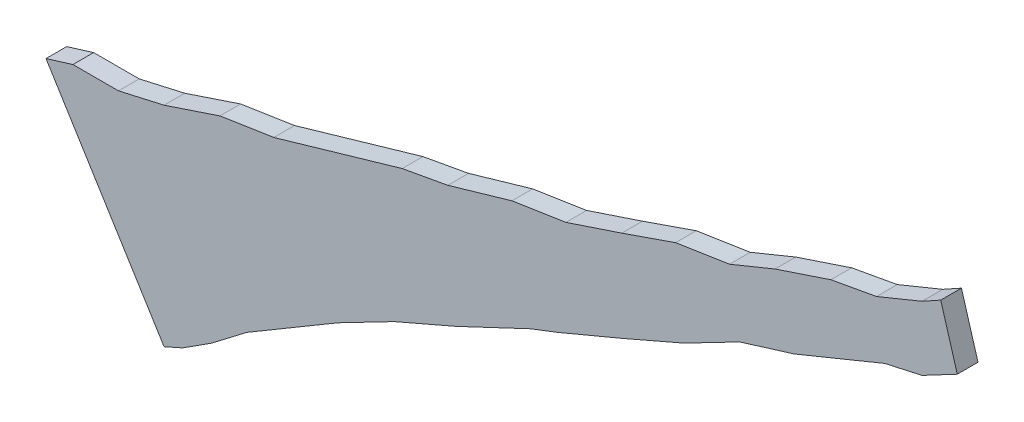
ISO-10303-21;
HEADER;
FILE_DESCRIPTION(('STEP AP214'),'2;1');
FILE_NAME('part.step','',(''),(''),'','','');
FILE_SCHEMA(('AUTOMOTIVE_DESIGN { 1 0 10303 214 1 1 1 1 }'));
ENDSEC;
DATA;
#1=APPLICATION_CONTEXT('core data for automotive mechanical design processes');
#2=APPLICATION_PROTOCOL_DEFINITION('international standard','automotive_design',2000,#1);
#3=PRODUCT_CONTEXT('',#1,'mechanical');
#4=PRODUCT('Part','Part','',(#3));
#5=PRODUCT_RELATED_PRODUCT_CATEGORY('part','',(#4));
#6=PRODUCT_DEFINITION_FORMATION('','',#4);
#7=PRODUCT_DEFINITION_CONTEXT('part definition',#1,'design');
#8=PRODUCT_DEFINITION('design','',#6,#7);
#9=PRODUCT_DEFINITION_SHAPE('','',#8);
#10=(LENGTH_UNIT() NAMED_UNIT(*) SI_UNIT(.MILLI.,.METRE.));
#11=(NAMED_UNIT(*) PLANE_ANGLE_UNIT() SI_UNIT($,.RADIAN.));
#12=(NAMED_UNIT(*) SI_UNIT($,.STERADIAN.) SOLID_ANGLE_UNIT());
#13=UNCERTAINTY_MEASURE_WITH_UNIT(LENGTH_MEASURE(1.E-05),#10,'distance_accuracy_value','');
#14=(GEOMETRIC_REPRESENTATION_CONTEXT(3) GLOBAL_UNCERTAINTY_ASSIGNED_CONTEXT((#13)) GLOBAL_UNIT_ASSIGNED_CONTEXT((#10,
#11,#12)) REPRESENTATION_CONTEXT('',''));
#15=CARTESIAN_POINT('',(0.,0.,0.));
#16=DIRECTION('',(0.,0.,1.));
#17=DIRECTION('',(1.,0.,0.));
#18=AXIS2_PLACEMENT_3D('',#15,#16,#17);
#19=CARTESIAN_POINT('',(0.,0.,0.01));
#20=DIRECTION('',(0.,0.,1.));
#21=DIRECTION('',(1.,0.,0.));
#22=AXIS2_PLACEMENT_3D('',#19,#20,#21);
#23=PLANE('',#22);
#24=DIRECTION('',(0.860926528214329,0.508729312126617,0.));
#25=VECTOR('',#24,1.);
#26=CARTESIAN_POINT('',(0.831,-0.35,0.01));
#27=LINE('',#26,#25);
#28=CARTESIAN_POINT('',(0.875,-0.324,0.01));
#29=VERTEX_POINT('',#28);
#30=CARTESIAN_POINT('',(0.831,-0.35,0.01));
#31=VERTEX_POINT('',#30);
#32=EDGE_CURVE('E250',#29,#31,#27,.F.);
#33=ORIENTED_EDGE('',*,*,#32,.F.);
#34=DIRECTION('',(0.887754531448923,0.460317164455012,0.));
#35=VECTOR('',#34,1.);
#36=CARTESIAN_POINT('',(0.875,-0.324,0.01));
#37=LINE('',#36,#35);
#38=CARTESIAN_POINT('',(0.902,-0.31,0.01));
#39=VERTEX_POINT('',#38);
#40=EDGE_CURVE('E20',#39,#29,#37,.F.);
#41=ORIENTED_EDGE('',*,*,#40,.F.);
#42=DIRECTION('',(0.917555625309921,0.397607437634309,0.));
#43=VECTOR('',#42,1.);
#44=CARTESIAN_POINT('',(0.902,-0.31,0.01));
#45=LINE('',#44,#43);
#46=CARTESIAN_POINT('',(0.932,-0.297,0.01));
#47=VERTEX_POINT('',#46);
#48=EDGE_CURVE('E239',#47,#39,#45,.F.);
#49=ORIENTED_EDGE('',*,*,#48,.F.);
#50=DIRECTION('',(0.904248646746004,0.427006305407802,0.));
#51=VECTOR('',#50,1.);
#52=CARTESIAN_POINT('',(0.932,-0.297,0.01));
#53=LINE('',#52,#51);
#54=CARTESIAN_POINT('',(0.968,-0.28,0.01));
#55=VERTEX_POINT('',#54);
#56=EDGE_CURVE('E234',#55,#47,#53,.F.);
#57=ORIENTED_EDGE('',*,*,#56,.F.);
#58=DIRECTION('',(0.933345606203054,0.358979079308882,0.));
#59=VECTOR('',#58,1.);
#60=CARTESIAN_POINT('',(0.968,-0.28,0.01));
#61=LINE('',#60,#59);
#62=CARTESIAN_POINT('',(0.980999999999999,-0.275,0.01));
#63=VERTEX_POINT('',#62);
#64=EDGE_CURVE('E261',#63,#55,#61,.F.);
#65=ORIENTED_EDGE('',*,*,#64,.F.);
#66=DIRECTION('',(0.922194381828517,0.386726676250707,0.));
#67=VECTOR('',#66,1.);
#68=CARTESIAN_POINT('',(0.981,-0.275,0.01));
#69=LINE('',#68,#67);
#70=CARTESIAN_POINT('',(1.01200000000004,-0.261999999999983,0.01));
#71=VERTEX_POINT('',#70);
#72=EDGE_CURVE('E265',#71,#63,#69,.F.);
#73=ORIENTED_EDGE('',*,*,#72,.F.);
#74=DIRECTION('',(0.917555625309921,0.397607437634309,0.));
#75=VECTOR('',#74,1.);
#76=CARTESIAN_POINT('',(1.012,-0.262,0.01));
#77=LINE('',#76,#75);
#78=CARTESIAN_POINT('',(1.042,-0.249,0.01));
#79=VERTEX_POINT('',#78);
#80=EDGE_CURVE('E269',#79,#71,#77,.F.);
#81=ORIENTED_EDGE('',*,*,#80,.F.);
#82=DIRECTION('',(0.887754531448923,0.460317164455012,0.));
#83=VECTOR('',#82,1.);
#84=CARTESIAN_POINT('',(1.042,-0.249,0.01));
#85=LINE('',#84,#83);
#86=CARTESIAN_POINT('',(1.069,-0.235,0.01));
#87=VERTEX_POINT('',#86);
#88=EDGE_CURVE('E273',#87,#79,#85,.F.);
#89=ORIENTED_EDGE('',*,*,#88,.F.);
#90=DIRECTION('',(0.955779008721961,0.294085848837488,0.));
#91=VECTOR('',#90,1.);
#92=CARTESIAN_POINT('',(1.069,-0.235,0.01));
#93=LINE('',#92,#91);
#94=CARTESIAN_POINT('',(1.095,-0.227,0.01));
#95=VERTEX_POINT('',#94);
#96=EDGE_CURVE('E277',#95,#87,#93,.F.);
#97=ORIENTED_EDGE('',*,*,#96,.F.);
#98=DIRECTION('',(0.925546956205682,0.378632845720492,0.));
#99=VECTOR('',#98,1.);
#100=CARTESIAN_POINT('',(1.095,-0.227,0.01));
#101=LINE('',#100,#99);
#102=CARTESIAN_POINT('',(1.139,-0.209,0.01));
#103=VERTEX_POINT('',#102);
#104=EDGE_CURVE('E281',#103,#95,#101,.F.);
#105=ORIENTED_EDGE('',*,*,#104,.F.);
#106=DIRECTION('',(0.976187060183946,0.216930457818688,0.));
#107=VECTOR('',#106,1.);
#108=CARTESIAN_POINT('',(1.139,-0.209,0.01));
#109=LINE('',#108,#107);
#110=CARTESIAN_POINT('',(1.157,-0.205,0.01));
#111=VERTEX_POINT('',#110);
#112=EDGE_CURVE('E285',#111,#103,#109,.F.);
#113=ORIENTED_EDGE('',*,*,#112,.F.);
#114=DIRECTION('',(0.883787916347084,0.467887720418991,0.));
#115=VECTOR('',#114,1.);
#116=CARTESIAN_POINT('',(1.157,-0.205,0.01));
#117=LINE('',#116,#115);
#118=CARTESIAN_POINT('',(1.174,-0.196,0.01));
#119=VERTEX_POINT('',#118);
#120=EDGE_CURVE('E289',#119,#111,#117,.F.);
#121=ORIENTED_EDGE('',*,*,#120,.F.);
#122=DIRECTION('',(-0.284088329691394,0.958798112708381,0.));
#123=VECTOR('',#122,1.);
#124=CARTESIAN_POINT('',(1.174,-0.196,0.01));
#125=LINE('',#124,#123);
#126=CARTESIAN_POINT('',(1.166,-0.169,0.01));
#127=VERTEX_POINT('',#126);
#128=EDGE_CURVE('E293',#127,#119,#125,.F.);
#129=ORIENTED_EDGE('',*,*,#128,.F.);
#130=DIRECTION('',(-0.874157276121542,-0.485642931178624,0.));
#131=VECTOR('',#130,1.);
#132=CARTESIAN_POINT('',(1.166,-0.169,0.01));
#133=LINE('',#132,#131);
#134=CARTESIAN_POINT('',(1.157,-0.174,0.01));
#135=VERTEX_POINT('',#134);
#136=EDGE_CURVE('E297',#135,#127,#133,.F.);
#137=ORIENTED_EDGE('',*,*,#136,.F.);
#138=DIRECTION('',(-0.925546956205682,-0.378632845720492,0.));
#139=VECTOR('',#138,1.);
#140=CARTESIAN_POINT('',(1.157,-0.174,0.01));
#141=LINE('',#140,#139);
#142=CARTESIAN_POINT('',(1.135,-0.183,0.01));
#143=VERTEX_POINT('',#142);
#144=EDGE_CURVE('E301',#143,#135,#141,.F.);
#145=ORIENTED_EDGE('',*,*,#144,.F.);
#146=DIRECTION('',(-0.983869910099904,-0.178885438200001,0.));
#147=VECTOR('',#146,1.);
#148=CARTESIAN_POINT('',(1.135,-0.183,0.01));
#149=LINE('',#148,#147);
#150=CARTESIAN_POINT('',(1.113,-0.187,0.01));
#151=VERTEX_POINT('',#150);
#152=EDGE_CURVE('E305',#151,#143,#149,.F.);
#153=ORIENTED_EDGE('',*,*,#152,.F.);
#154=DIRECTION('',(-0.948683298050524,-0.316227766016808,0.));
#155=VECTOR('',#154,1.);
#156=CARTESIAN_POINT('',(1.113,-0.187,0.01));
#157=LINE('',#156,#155);
#158=CARTESIAN_POINT('',(1.086,-0.195999999999999,0.01));
#159=VERTEX_POINT('',#158);
#160=EDGE_CURVE('E309',#159,#151,#157,.F.);
#161=ORIENTED_EDGE('',*,*,#160,.F.);
#162=DIRECTION('',(-0.925546956205682,-0.378632845720492,0.));
#163=VECTOR('',#162,1.);
#164=CARTESIAN_POINT('',(1.086,-0.196,0.01));
#165=LINE('',#164,#163);
#166=CARTESIAN_POINT('',(1.064,-0.205,0.01));
#167=VERTEX_POINT('',#166);
#168=EDGE_CURVE('E313',#167,#159,#165,.F.);
#169=ORIENTED_EDGE('',*,*,#168,.F.);
#170=DIRECTION('',(-0.988371697650623,-0.152057184253904,0.));
#171=VECTOR('',#170,1.);
#172=CARTESIAN_POINT('',(1.064,-0.205,0.01));
#173=LINE('',#172,#171);
#174=CARTESIAN_POINT('',(1.038,-0.209,0.01));
#175=VERTEX_POINT('',#174);
#176=EDGE_CURVE('E317',#175,#167,#173,.F.);
#177=ORIENTED_EDGE('',*,*,#176,.F.);
#178=DIRECTION('',(-0.944986073440252,-0.327110563883183,0.));
#179=VECTOR('',#178,1.);
#180=CARTESIAN_POINT('',(1.038,-0.209,0.01));
#181=LINE('',#180,#179);
#182=CARTESIAN_POINT('',(1.01199999999998,-0.218000000000008,0.01));
#183=VERTEX_POINT('',#182);
#184=EDGE_CURVE('E321',#183,#175,#181,.F.);
#185=ORIENTED_EDGE('',*,*,#184,.F.);
#186=DIRECTION('',(-0.948683298050524,-0.316227766016808,0.));
#187=VECTOR('',#186,1.);
#188=CARTESIAN_POINT('',(1.012,-0.218,0.01));
#189=LINE('',#188,#187);
#190=CARTESIAN_POINT('',(0.985,-0.227,0.01));
#191=VERTEX_POINT('',#190);
#192=EDGE_CURVE('E325',#191,#183,#189,.F.);
#193=ORIENTED_EDGE('',*,*,#192,.F.);
#194=DIRECTION('',(-0.988371697650623,-0.152057184253904,0.));
#195=VECTOR('',#194,1.);
#196=CARTESIAN_POINT('',(0.985,-0.227,0.01));
#197=LINE('',#196,#195);
#198=CARTESIAN_POINT('',(0.959,-0.231,0.01));
#199=VERTEX_POINT('',#198);
#200=EDGE_CURVE('E329',#199,#191,#197,.F.);
#201=ORIENTED_EDGE('',*,*,#200,.F.);
#202=DIRECTION('',(-0.96034622675361,-0.278810194864003,0.));
#203=VECTOR('',#202,1.);
#204=CARTESIAN_POINT('',(0.959,-0.231,0.01));
#205=LINE('',#204,#203);
#206=CARTESIAN_POINT('',(0.928,-0.24,0.01));
#207=VERTEX_POINT('',#206);
#208=EDGE_CURVE('E333',#207,#199,#205,.F.);
#209=ORIENTED_EDGE('',*,*,#208,.F.);
#210=DIRECTION('',(-0.983869910099904,-0.178885438200001,0.));
#211=VECTOR('',#210,1.);
#212=CARTESIAN_POINT('',(0.928,-0.24,0.01));
#213=LINE('',#212,#211);
#214=CARTESIAN_POINT('',(0.906,-0.244,0.01));
#215=VERTEX_POINT('',#214);
#216=EDGE_CURVE('E337',#215,#207,#213,.F.);
#217=ORIENTED_EDGE('',*,*,#216,.F.);
#218=DIRECTION('',(-0.96034622675361,-0.278810194864003,0.));
#219=VECTOR('',#218,1.);
#220=CARTESIAN_POINT('',(0.906,-0.244,0.01));
#221=LINE('',#220,#219);
#222=CARTESIAN_POINT('',(0.844,-0.262000000000001,0.01));
#223=VERTEX_POINT('',#222);
#224=EDGE_CURVE('E341',#223,#215,#221,.F.);
#225=ORIENTED_EDGE('',*,*,#224,.F.);
#226=DIRECTION('',(-0.988371697650623,-0.152057184253904,0.));
#227=VECTOR('',#226,1.);
#228=CARTESIAN_POINT('',(0.844,-0.262,0.01));
#229=LINE('',#228,#227);
#230=CARTESIAN_POINT('',(0.818,-0.266,0.01));
#231=VERTEX_POINT('',#230);
#232=EDGE_CURVE('E345',#231,#223,#229,.F.);
#233=ORIENTED_EDGE('',*,*,#232,.F.);
#234=DIRECTION('',(-0.948683298050524,-0.316227766016808,0.));
#235=VECTOR('',#234,1.);
#236=CARTESIAN_POINT('',(0.818,-0.266,0.01));
#237=LINE('',#236,#235);
#238=CARTESIAN_POINT('',(0.791,-0.275,0.01));
#239=VERTEX_POINT('',#238);
#240=EDGE_CURVE('E349',#239,#231,#237,.F.);
#241=ORIENTED_EDGE('',*,*,#240,.F.);
#242=DIRECTION('',(-0.975132855791455,-0.22162110358899,0.));
#243=VECTOR('',#242,1.);
#244=CARTESIAN_POINT('',(0.791,-0.275,0.01));
#245=LINE('',#244,#243);
#246=CARTESIAN_POINT('',(0.769,-0.28,0.01));
#247=VERTEX_POINT('',#246);
#248=EDGE_CURVE('E353',#247,#239,#245,.F.);
#249=ORIENTED_EDGE('',*,*,#248,.F.);
#250=DIRECTION('',(1.,0.,0.));
#251=VECTOR('',#250,1.);
#252=CARTESIAN_POINT('',(0.769,-0.28,0.01));
#253=LINE('',#252,#251);
#254=CARTESIAN_POINT('',(0.746999999999999,-0.28,0.01));
#255=VERTEX_POINT('',#254);
#256=EDGE_CURVE('E357',#255,#247,#253,.T.);
#257=ORIENTED_EDGE('',*,*,#256,.F.);
#258=DIRECTION('',(-0.955779008721961,-0.294085848837488,0.));
#259=VECTOR('',#258,1.);
#260=CARTESIAN_POINT('',(0.747,-0.28,0.01));
#261=LINE('',#260,#259);
#262=CARTESIAN_POINT('',(0.734,-0.284,0.01));
#263=VERTEX_POINT('',#262);
#264=EDGE_CURVE('E361',#263,#255,#261,.F.);
#265=ORIENTED_EDGE('',*,*,#264,.F.);
#266=DIRECTION('',(0.526672671716798,-0.850068171893696,0.));
#267=VECTOR('',#266,1.);
#268=CARTESIAN_POINT('',(0.734,-0.284,0.01));
#269=LINE('',#268,#267);
#270=CARTESIAN_POINT('',(0.791000000000001,-0.375999999999999,0.01));
#271=VERTEX_POINT('',#270);
#272=EDGE_CURVE('E365',#271,#263,#269,.F.);
#273=ORIENTED_EDGE('',*,*,#272,.F.);
#274=DIRECTION('',(0.913811548620282,0.406138466053392,0.));
#275=VECTOR('',#274,1.);
#276=CARTESIAN_POINT('',(0.791,-0.376,0.01));
#277=LINE('',#276,#275);
#278=CARTESIAN_POINT('',(0.8,-0.372,0.01));
#279=VERTEX_POINT('',#278);
#280=EDGE_CURVE('E369',#279,#271,#277,.F.);
#281=ORIENTED_EDGE('',*,*,#280,.F.);
#282=DIRECTION('',(0.841178475376567,0.540757591313479,0.));
#283=VECTOR('',#282,1.);
#284=CARTESIAN_POINT('',(0.8,-0.372,0.01));
#285=LINE('',#284,#283);
#286=CARTESIAN_POINT('',(0.814,-0.363,0.01));
#287=VERTEX_POINT('',#286);
#288=EDGE_CURVE('E373',#287,#279,#285,.F.);
#289=ORIENTED_EDGE('',*,*,#288,.F.);
#290=DIRECTION('',(0.794357832977196,0.607450107570797,0.));
#291=VECTOR('',#290,1.);
#292=CARTESIAN_POINT('',(0.814,-0.363,0.01));
#293=LINE('',#292,#291);
#294=EDGE_CURVE('E377',#31,#287,#293,.F.);
#295=ORIENTED_EDGE('',*,*,#294,.F.);
#296=EDGE_LOOP('',(#33,#41,#49,#57,#65,#73,#81,#89,#97,#105,#113,#121,#129,#137,#145,#153,#161,
#169,#177,#185,#193,#201,#209,#217,#225,#233,#241,#249,#257,#265,#273,#281,#289,#295));
#297=FACE_BOUND('',#296,.T.);
#298=ADVANCED_FACE('F17',(#297),#23,.T.);
#299=CARTESIAN_POINT('',(0.875,-0.324,0.));
#300=DIRECTION('',(0.460317164455012,-0.887754531448923,0.));
#301=DIRECTION('',(0.887754531448923,0.460317164455012,0.));
#302=AXIS2_PLACEMENT_3D('',#299,#300,#301);
#303=PLANE('',#302);
#304=DIRECTION('',(0.,0.,1.));
#305=VECTOR('',#304,1.);
#306=CARTESIAN_POINT('',(0.875000000000001,-0.324000000000001,0.));
#307=LINE('',#306,#305);
#308=CARTESIAN_POINT('',(0.875000000000001,-0.324,0.));
#309=VERTEX_POINT('',#308);
#310=EDGE_CURVE('E381',#309,#29,#307,.T.);
#311=ORIENTED_EDGE('',*,*,#310,.F.);
#312=DIRECTION('',(0.887754531448929,0.460317164455001,0.));
#313=VECTOR('',#312,1.);
#314=CARTESIAN_POINT('',(0.875,-0.324,0.));
#315=LINE('',#314,#313);
#316=CARTESIAN_POINT('',(0.902,-0.31,0.));
#317=VERTEX_POINT('',#316);
#318=EDGE_CURVE('E256',#309,#317,#315,.T.);
#319=ORIENTED_EDGE('',*,*,#318,.T.);
#320=DIRECTION('',(0.,0.,1.));
#321=VECTOR('',#320,1.);
#322=CARTESIAN_POINT('',(0.902,-0.31,0.));
#323=LINE('',#322,#321);
#324=EDGE_CURVE('E244',#39,#317,#323,.F.);
#325=ORIENTED_EDGE('',*,*,#324,.F.);
#326=ORIENTED_EDGE('',*,*,#40,.T.);
#327=EDGE_LOOP('',(#311,#319,#325,#326));
#328=FACE_BOUND('',#327,.T.);
#329=ADVANCED_FACE('F255',(#328),#303,.T.);
#330=CARTESIAN_POINT('',(0.902,-0.31,0.));
#331=DIRECTION('',(0.397607437634309,-0.917555625309921,0.));
#332=DIRECTION('',(0.917555625309921,0.397607437634309,0.));
#333=AXIS2_PLACEMENT_3D('',#330,#331,#332);
#334=PLANE('',#333);
#335=ORIENTED_EDGE('',*,*,#324,.T.);
#336=DIRECTION('',(0.917555625309925,0.397607437634299,0.));
#337=VECTOR('',#336,1.);
#338=CARTESIAN_POINT('',(0.902,-0.31,0.));
#339=LINE('',#338,#337);
#340=CARTESIAN_POINT('',(0.932,-0.297,0.));
#341=VERTEX_POINT('',#340);
#342=EDGE_CURVE('E386',#317,#341,#339,.T.);
#343=ORIENTED_EDGE('',*,*,#342,.T.);
#344=DIRECTION('',(0.,0.,1.));
#345=VECTOR('',#344,1.);
#346=CARTESIAN_POINT('',(0.932,-0.297,0.));
#347=LINE('',#346,#345);
#348=EDGE_CURVE('E246',#47,#341,#347,.F.);
#349=ORIENTED_EDGE('',*,*,#348,.F.);
#350=ORIENTED_EDGE('',*,*,#48,.T.);
#351=EDGE_LOOP('',(#335,#343,#349,#350));
#352=FACE_BOUND('',#351,.T.);
#353=ADVANCED_FACE('F241',(#352),#334,.T.);
#354=CARTESIAN_POINT('',(0.932,-0.297,0.));
#355=DIRECTION('',(0.427006305407802,-0.904248646746004,0.));
#356=DIRECTION('',(0.904248646746004,0.427006305407802,0.));
#357=AXIS2_PLACEMENT_3D('',#354,#355,#356);
#358=PLANE('',#357);
#359=ORIENTED_EDGE('',*,*,#348,.T.);
#360=DIRECTION('',(0.904248646745991,0.42700630540783,0.));
#361=VECTOR('',#360,1.);
#362=CARTESIAN_POINT('',(0.932,-0.297,0.));
#363=LINE('',#362,#361);
#364=CARTESIAN_POINT('',(0.968,-0.280000000000001,0.));
#365=VERTEX_POINT('',#364);
#366=EDGE_CURVE('E388',#341,#365,#363,.T.);
#367=ORIENTED_EDGE('',*,*,#366,.T.);
#368=DIRECTION('',(0.,0.,1.));
#369=VECTOR('',#368,1.);
#370=CARTESIAN_POINT('',(0.968,-0.28,0.));
#371=LINE('',#370,#369);
#372=EDGE_CURVE('E263',#55,#365,#371,.F.);
#373=ORIENTED_EDGE('',*,*,#372,.F.);
#374=ORIENTED_EDGE('',*,*,#56,.T.);
#375=EDGE_LOOP('',(#359,#367,#373,#374));
#376=FACE_BOUND('',#375,.T.);
#377=ADVANCED_FACE('F630',(#376),#358,.T.);
#378=CARTESIAN_POINT('',(0.968,-0.28,0.));
#379=DIRECTION('',(0.358979079308882,-0.933345606203054,0.));
#380=DIRECTION('',(0.933345606203054,0.358979079308882,0.));
#381=AXIS2_PLACEMENT_3D('',#378,#379,#380);
#382=PLANE('',#381);
#383=ORIENTED_EDGE('',*,*,#372,.T.);
#384=DIRECTION('',(0.93334560620306,0.358979079308868,0.));
#385=VECTOR('',#384,1.);
#386=CARTESIAN_POINT('',(0.968,-0.28,0.));
#387=LINE('',#386,#385);
#388=CARTESIAN_POINT('',(0.981,-0.275,0.));
#389=VERTEX_POINT('',#388);
#390=EDGE_CURVE('E391',#365,#389,#387,.T.);
#391=ORIENTED_EDGE('',*,*,#390,.T.);
#392=DIRECTION('',(0.,0.,1.));
#393=VECTOR('',#392,1.);
#394=CARTESIAN_POINT('',(0.981,-0.275,0.));
#395=LINE('',#394,#393);
#396=EDGE_CURVE('E267',#63,#389,#395,.F.);
#397=ORIENTED_EDGE('',*,*,#396,.F.);
#398=ORIENTED_EDGE('',*,*,#64,.T.);
#399=EDGE_LOOP('',(#383,#391,#397,#398));
#400=FACE_BOUND('',#399,.T.);
#401=ADVANCED_FACE('F629',(#400),#382,.T.);
#402=CARTESIAN_POINT('',(0.981,-0.275,0.));
#403=DIRECTION('',(0.386726676250707,-0.922194381828517,0.));
#404=DIRECTION('',(0.922194381828517,0.386726676250707,0.));
#405=AXIS2_PLACEMENT_3D('',#402,#403,#404);
#406=PLANE('',#405);
#407=ORIENTED_EDGE('',*,*,#396,.T.);
#408=DIRECTION('',(0.922194381828531,0.386726676250674,0.));
#409=VECTOR('',#408,1.);
#410=CARTESIAN_POINT('',(0.981,-0.275,0.));
#411=LINE('',#410,#409);
#412=CARTESIAN_POINT('',(1.01200000000002,-0.261999999999991,0.));
#413=VERTEX_POINT('',#412);
#414=EDGE_CURVE('E394',#389,#413,#411,.T.);
#415=ORIENTED_EDGE('',*,*,#414,.T.);
#416=DIRECTION('',(0.,0.,1.));
#417=VECTOR('',#416,1.);
#418=CARTESIAN_POINT('',(1.012,-0.262,0.));
#419=LINE('',#418,#417);
#420=EDGE_CURVE('E271',#71,#413,#419,.F.);
#421=ORIENTED_EDGE('',*,*,#420,.F.);
#422=ORIENTED_EDGE('',*,*,#72,.T.);
#423=EDGE_LOOP('',(#407,#415,#421,#422));
#424=FACE_BOUND('',#423,.T.);
#425=ADVANCED_FACE('F623',(#424),#406,.T.);
#426=CARTESIAN_POINT('',(1.012,-0.262,0.));
#427=DIRECTION('',(0.397607437634309,-0.917555625309921,0.));
#428=DIRECTION('',(0.917555625309921,0.397607437634309,0.));
#429=AXIS2_PLACEMENT_3D('',#426,#427,#428);
#430=PLANE('',#429);
#431=ORIENTED_EDGE('',*,*,#420,.T.);
#432=DIRECTION('',(0.917555625309923,0.397607437634303,0.));
#433=VECTOR('',#432,1.);
#434=CARTESIAN_POINT('',(1.012,-0.262,0.));
#435=LINE('',#434,#433);
#436=CARTESIAN_POINT('',(1.042,-0.249,0.));
#437=VERTEX_POINT('',#436);
#438=EDGE_CURVE('E397',#413,#437,#435,.T.);
#439=ORIENTED_EDGE('',*,*,#438,.T.);
#440=DIRECTION('',(0.,0.,1.));
#441=VECTOR('',#440,1.);
#442=CARTESIAN_POINT('',(1.042,-0.249,0.));
#443=LINE('',#442,#441);
#444=EDGE_CURVE('E275',#79,#437,#443,.F.);
#445=ORIENTED_EDGE('',*,*,#444,.F.);
#446=ORIENTED_EDGE('',*,*,#80,.T.);
#447=EDGE_LOOP('',(#431,#439,#445,#446));
#448=FACE_BOUND('',#447,.T.);
#449=ADVANCED_FACE('F619',(#448),#430,.T.);
#450=CARTESIAN_POINT('',(1.042,-0.249,0.));
#451=DIRECTION('',(0.460317164455012,-0.887754531448923,0.));
#452=DIRECTION('',(0.887754531448923,0.460317164455012,0.));
#453=AXIS2_PLACEMENT_3D('',#450,#451,#452);
#454=PLANE('',#453);
#455=ORIENTED_EDGE('',*,*,#444,.T.);
#456=DIRECTION('',(0.88775453144893,0.460317164454999,0.));
#457=VECTOR('',#456,1.);
#458=CARTESIAN_POINT('',(1.042,-0.249,0.));
#459=LINE('',#458,#457);
#460=CARTESIAN_POINT('',(1.069,-0.235,0.));
#461=VERTEX_POINT('',#460);
#462=EDGE_CURVE('E400',#437,#461,#459,.T.);
#463=ORIENTED_EDGE('',*,*,#462,.T.);
#464=DIRECTION('',(0.,0.,1.));
#465=VECTOR('',#464,1.);
#466=CARTESIAN_POINT('',(1.069,-0.235,0.));
#467=LINE('',#466,#465);
#468=EDGE_CURVE('E279',#87,#461,#467,.F.);
#469=ORIENTED_EDGE('',*,*,#468,.F.);
#470=ORIENTED_EDGE('',*,*,#88,.T.);
#471=EDGE_LOOP('',(#455,#463,#469,#470));
#472=FACE_BOUND('',#471,.T.);
#473=ADVANCED_FACE('F613',(#472),#454,.T.);
#474=CARTESIAN_POINT('',(1.069,-0.235,0.));
#475=DIRECTION('',(0.294085848837488,-0.955779008721961,0.));
#476=DIRECTION('',(0.955779008721961,0.294085848837488,0.));
#477=AXIS2_PLACEMENT_3D('',#474,#475,#476);
#478=PLANE('',#477);
#479=ORIENTED_EDGE('',*,*,#468,.T.);
#480=DIRECTION('',(0.95577900872195,0.294085848837523,0.));
#481=VECTOR('',#480,1.);
#482=CARTESIAN_POINT('',(1.069,-0.235,0.));
#483=LINE('',#482,#481);
#484=CARTESIAN_POINT('',(1.095,-0.227,0.));
#485=VERTEX_POINT('',#484);
#486=EDGE_CURVE('E403',#461,#485,#483,.T.);
#487=ORIENTED_EDGE('',*,*,#486,.T.);
#488=DIRECTION('',(0.,0.,1.));
#489=VECTOR('',#488,1.);
#490=CARTESIAN_POINT('',(1.095,-0.227,0.));
#491=LINE('',#490,#489);
#492=EDGE_CURVE('E283',#95,#485,#491,.F.);
#493=ORIENTED_EDGE('',*,*,#492,.F.);
#494=ORIENTED_EDGE('',*,*,#96,.T.);
#495=EDGE_LOOP('',(#479,#487,#493,#494));
#496=FACE_BOUND('',#495,.T.);
#497=ADVANCED_FACE('F609',(#496),#478,.T.);
#498=CARTESIAN_POINT('',(1.095,-0.227,0.));
#499=DIRECTION('',(0.378632845720492,-0.925546956205682,0.));
#500=DIRECTION('',(0.925546956205682,0.378632845720492,0.));
#501=AXIS2_PLACEMENT_3D('',#498,#499,#500);
#502=PLANE('',#501);
#503=ORIENTED_EDGE('',*,*,#492,.T.);
#504=DIRECTION('',(0.925546956205677,0.378632845720505,0.));
#505=VECTOR('',#504,1.);
#506=CARTESIAN_POINT('',(1.095,-0.227,0.));
#507=LINE('',#506,#505);
#508=CARTESIAN_POINT('',(1.139,-0.209,0.));
#509=VERTEX_POINT('',#508);
#510=EDGE_CURVE('E406',#485,#509,#507,.T.);
#511=ORIENTED_EDGE('',*,*,#510,.T.);
#512=DIRECTION('',(0.,0.,1.));
#513=VECTOR('',#512,1.);
#514=CARTESIAN_POINT('',(1.139,-0.209,0.));
#515=LINE('',#514,#513);
#516=EDGE_CURVE('E287',#103,#509,#515,.F.);
#517=ORIENTED_EDGE('',*,*,#516,.F.);
#518=ORIENTED_EDGE('',*,*,#104,.T.);
#519=EDGE_LOOP('',(#503,#511,#517,#518));
#520=FACE_BOUND('',#519,.T.);
#521=ADVANCED_FACE('F603',(#520),#502,.T.);
#522=CARTESIAN_POINT('',(1.139,-0.209,0.));
#523=DIRECTION('',(0.216930457818688,-0.976187060183946,0.));
#524=DIRECTION('',(0.976187060183946,0.216930457818688,0.));
#525=AXIS2_PLACEMENT_3D('',#522,#523,#524);
#526=PLANE('',#525);
#527=ORIENTED_EDGE('',*,*,#516,.T.);
#528=DIRECTION('',(0.976187060183953,0.216930457818656,0.));
#529=VECTOR('',#528,1.);
#530=CARTESIAN_POINT('',(1.139,-0.209,0.));
#531=LINE('',#530,#529);
#532=CARTESIAN_POINT('',(1.157,-0.205,0.));
#533=VERTEX_POINT('',#532);
#534=EDGE_CURVE('E409',#509,#533,#531,.T.);
#535=ORIENTED_EDGE('',*,*,#534,.T.);
#536=DIRECTION('',(0.,0.,1.));
#537=VECTOR('',#536,1.);
#538=CARTESIAN_POINT('',(1.157,-0.205,0.));
#539=LINE('',#538,#537);
#540=EDGE_CURVE('E291',#111,#533,#539,.F.);
#541=ORIENTED_EDGE('',*,*,#540,.F.);
#542=ORIENTED_EDGE('',*,*,#112,.T.);
#543=EDGE_LOOP('',(#527,#535,#541,#542));
#544=FACE_BOUND('',#543,.T.);
#545=ADVANCED_FACE('F599',(#544),#526,.T.);
#546=CARTESIAN_POINT('',(1.157,-0.205,0.));
#547=DIRECTION('',(0.467887720418991,-0.883787916347084,0.));
#548=DIRECTION('',(0.883787916347084,0.467887720418991,0.));
#549=AXIS2_PLACEMENT_3D('',#546,#547,#548);
#550=PLANE('',#549);
#551=ORIENTED_EDGE('',*,*,#540,.T.);
#552=DIRECTION('',(0.883787916347061,0.467887720419034,0.));
#553=VECTOR('',#552,1.);
#554=CARTESIAN_POINT('',(1.157,-0.205,0.));
#555=LINE('',#554,#553);
#556=CARTESIAN_POINT('',(1.174,-0.196,0.));
#557=VERTEX_POINT('',#556);
#558=EDGE_CURVE('E412',#533,#557,#555,.T.);
#559=ORIENTED_EDGE('',*,*,#558,.T.);
#560=DIRECTION('',(0.,0.,1.));
#561=VECTOR('',#560,1.);
#562=CARTESIAN_POINT('',(1.174,-0.196,0.));
#563=LINE('',#562,#561);
#564=EDGE_CURVE('E295',#119,#557,#563,.F.);
#565=ORIENTED_EDGE('',*,*,#564,.F.);
#566=ORIENTED_EDGE('',*,*,#120,.T.);
#567=EDGE_LOOP('',(#551,#559,#565,#566));
#568=FACE_BOUND('',#567,.T.);
#569=ADVANCED_FACE('F593',(#568),#550,.T.);
#570=CARTESIAN_POINT('',(1.174,-0.196,0.));
#571=DIRECTION('',(0.958798112708381,0.284088329691394,0.));
#572=DIRECTION('',(-0.284088329691394,0.958798112708381,0.));
#573=AXIS2_PLACEMENT_3D('',#570,#571,#572);
#574=PLANE('',#573);
#575=ORIENTED_EDGE('',*,*,#564,.T.);
#576=DIRECTION('',(-0.284088329691373,0.958798112708387,0.));
#577=VECTOR('',#576,1.);
#578=CARTESIAN_POINT('',(1.174,-0.196,0.));
#579=LINE('',#578,#577);
#580=CARTESIAN_POINT('',(1.166,-0.169,0.));
#581=VERTEX_POINT('',#580);
#582=EDGE_CURVE('E415',#557,#581,#579,.T.);
#583=ORIENTED_EDGE('',*,*,#582,.T.);
#584=DIRECTION('',(0.,0.,1.));
#585=VECTOR('',#584,1.);
#586=CARTESIAN_POINT('',(1.166,-0.169,0.));
#587=LINE('',#586,#585);
#588=EDGE_CURVE('E299',#127,#581,#587,.F.);
#589=ORIENTED_EDGE('',*,*,#588,.F.);
#590=ORIENTED_EDGE('',*,*,#128,.T.);
#591=EDGE_LOOP('',(#575,#583,#589,#590));
#592=FACE_BOUND('',#591,.T.);
#593=ADVANCED_FACE('F589',(#592),#574,.T.);
#594=CARTESIAN_POINT('',(1.166,-0.169,0.));
#595=DIRECTION('',(-0.485642931178624,0.874157276121542,0.));
#596=DIRECTION('',(-0.874157276121542,-0.485642931178624,0.));
#597=AXIS2_PLACEMENT_3D('',#594,#595,#596);
#598=PLANE('',#597);
#599=ORIENTED_EDGE('',*,*,#588,.T.);
#600=DIRECTION('',(-0.874157276121536,-0.485642931178635,0.));
#601=VECTOR('',#600,1.);
#602=CARTESIAN_POINT('',(1.166,-0.169,0.));
#603=LINE('',#602,#601);
#604=CARTESIAN_POINT('',(1.157,-0.174,0.));
#605=VERTEX_POINT('',#604);
#606=EDGE_CURVE('E418',#581,#605,#603,.T.);
#607=ORIENTED_EDGE('',*,*,#606,.T.);
#608=DIRECTION('',(0.,0.,1.));
#609=VECTOR('',#608,1.);
#610=CARTESIAN_POINT('',(1.157,-0.174,0.));
#611=LINE('',#610,#609);
#612=EDGE_CURVE('E303',#135,#605,#611,.F.);
#613=ORIENTED_EDGE('',*,*,#612,.F.);
#614=ORIENTED_EDGE('',*,*,#136,.T.);
#615=EDGE_LOOP('',(#599,#607,#613,#614));
#616=FACE_BOUND('',#615,.T.);
#617=ADVANCED_FACE('F583',(#616),#598,.T.);
#618=CARTESIAN_POINT('',(1.157,-0.174,0.));
#619=DIRECTION('',(-0.378632845720492,0.925546956205682,0.));
#620=DIRECTION('',(-0.925546956205682,-0.378632845720492,0.));
#621=AXIS2_PLACEMENT_3D('',#618,#619,#620);
#622=PLANE('',#621);
#623=ORIENTED_EDGE('',*,*,#612,.T.);
#624=DIRECTION('',(-0.925546956205677,-0.378632845720503,0.));
#625=VECTOR('',#624,1.);
#626=CARTESIAN_POINT('',(1.157,-0.174,0.));
#627=LINE('',#626,#625);
#628=CARTESIAN_POINT('',(1.135,-0.183,0.));
#629=VERTEX_POINT('',#628);
#630=EDGE_CURVE('E421',#605,#629,#627,.T.);
#631=ORIENTED_EDGE('',*,*,#630,.T.);
#632=DIRECTION('',(0.,0.,1.));
#633=VECTOR('',#632,1.);
#634=CARTESIAN_POINT('',(1.135,-0.183,0.));
#635=LINE('',#634,#633);
#636=EDGE_CURVE('E307',#143,#629,#635,.F.);
#637=ORIENTED_EDGE('',*,*,#636,.F.);
#638=ORIENTED_EDGE('',*,*,#144,.T.);
#639=EDGE_LOOP('',(#623,#631,#637,#638));
#640=FACE_BOUND('',#639,.T.);
#641=ADVANCED_FACE('F579',(#640),#622,.T.);
#642=CARTESIAN_POINT('',(1.135,-0.183,0.));
#643=DIRECTION('',(-0.178885438200001,0.983869910099904,0.));
#644=DIRECTION('',(-0.983869910099904,-0.178885438200001,0.));
#645=AXIS2_PLACEMENT_3D('',#642,#643,#644);
#646=PLANE('',#645);
#647=ORIENTED_EDGE('',*,*,#636,.T.);
#648=DIRECTION('',(-0.983869910099907,-0.178885438199984,0.));
#649=VECTOR('',#648,1.);
#650=CARTESIAN_POINT('',(1.135,-0.183,0.));
#651=LINE('',#650,#649);
#652=CARTESIAN_POINT('',(1.113,-0.187,0.));
#653=VERTEX_POINT('',#652);
#654=EDGE_CURVE('E424',#629,#653,#651,.T.);
#655=ORIENTED_EDGE('',*,*,#654,.T.);
#656=DIRECTION('',(0.,0.,1.));
#657=VECTOR('',#656,1.);
#658=CARTESIAN_POINT('',(1.113,-0.187,0.));
#659=LINE('',#658,#657);
#660=EDGE_CURVE('E311',#151,#653,#659,.F.);
#661=ORIENTED_EDGE('',*,*,#660,.F.);
#662=ORIENTED_EDGE('',*,*,#152,.T.);
#663=EDGE_LOOP('',(#647,#655,#661,#662));
#664=FACE_BOUND('',#663,.T.);
#665=ADVANCED_FACE('F573',(#664),#646,.T.);
#666=CARTESIAN_POINT('',(1.113,-0.187,0.));
#667=DIRECTION('',(-0.316227766016808,0.948683298050524,0.));
#668=DIRECTION('',(-0.948683298050524,-0.316227766016808,0.));
#669=AXIS2_PLACEMENT_3D('',#666,#667,#668);
#670=PLANE('',#669);
#671=ORIENTED_EDGE('',*,*,#660,.T.);
#672=DIRECTION('',(-0.948683298050513,-0.31622776601684,0.));
#673=VECTOR('',#672,1.);
#674=CARTESIAN_POINT('',(1.113,-0.187,0.));
#675=LINE('',#674,#673);
#676=CARTESIAN_POINT('',(1.086,-0.195999999999999,0.));
#677=VERTEX_POINT('',#676);
#678=EDGE_CURVE('E427',#653,#677,#675,.T.);
#679=ORIENTED_EDGE('',*,*,#678,.T.);
#680=DIRECTION('',(0.,0.,1.));
#681=VECTOR('',#680,1.);
#682=CARTESIAN_POINT('',(1.086,-0.196,0.));
#683=LINE('',#682,#681);
#684=EDGE_CURVE('E315',#159,#677,#683,.F.);
#685=ORIENTED_EDGE('',*,*,#684,.F.);
#686=ORIENTED_EDGE('',*,*,#160,.T.);
#687=EDGE_LOOP('',(#671,#679,#685,#686));
#688=FACE_BOUND('',#687,.T.);
#689=ADVANCED_FACE('F569',(#688),#670,.T.);
#690=CARTESIAN_POINT('',(1.086,-0.196,0.));
#691=DIRECTION('',(-0.378632845720492,0.925546956205682,0.));
#692=DIRECTION('',(-0.925546956205682,-0.378632845720492,0.));
#693=AXIS2_PLACEMENT_3D('',#690,#691,#692);
#694=PLANE('',#693);
#695=ORIENTED_EDGE('',*,*,#684,.T.);
#696=DIRECTION('',(-0.925546956205678,-0.378632845720502,0.));
#697=VECTOR('',#696,1.);
#698=CARTESIAN_POINT('',(1.086,-0.196,0.));
#699=LINE('',#698,#697);
#700=CARTESIAN_POINT('',(1.064,-0.205,0.));
#701=VERTEX_POINT('',#700);
#702=EDGE_CURVE('E430',#677,#701,#699,.T.);
#703=ORIENTED_EDGE('',*,*,#702,.T.);
#704=DIRECTION('',(0.,0.,1.));
#705=VECTOR('',#704,1.);
#706=CARTESIAN_POINT('',(1.064,-0.205,0.));
#707=LINE('',#706,#705);
#708=EDGE_CURVE('E319',#167,#701,#707,.F.);
#709=ORIENTED_EDGE('',*,*,#708,.F.);
#710=ORIENTED_EDGE('',*,*,#168,.T.);
#711=EDGE_LOOP('',(#695,#703,#709,#710));
#712=FACE_BOUND('',#711,.T.);
#713=ADVANCED_FACE('F563',(#712),#694,.T.);
#714=CARTESIAN_POINT('',(1.064,-0.205,0.));
#715=DIRECTION('',(-0.152057184253904,0.988371697650623,0.));
#716=DIRECTION('',(-0.988371697650623,-0.152057184253904,0.));
#717=AXIS2_PLACEMENT_3D('',#714,#715,#716);
#718=PLANE('',#717);
#719=ORIENTED_EDGE('',*,*,#708,.T.);
#720=DIRECTION('',(-0.988371697650617,-0.152057184253941,0.));
#721=VECTOR('',#720,1.);
#722=CARTESIAN_POINT('',(1.064,-0.205,0.));
#723=LINE('',#722,#721);
#724=CARTESIAN_POINT('',(1.038,-0.208999999999999,0.));
#725=VERTEX_POINT('',#724);
#726=EDGE_CURVE('E433',#701,#725,#723,.T.);
#727=ORIENTED_EDGE('',*,*,#726,.T.);
#728=DIRECTION('',(0.,0.,1.));
#729=VECTOR('',#728,1.);
#730=CARTESIAN_POINT('',(1.038,-0.209,0.));
#731=LINE('',#730,#729);
#732=EDGE_CURVE('E323',#175,#725,#731,.F.);
#733=ORIENTED_EDGE('',*,*,#732,.F.);
#734=ORIENTED_EDGE('',*,*,#176,.T.);
#735=EDGE_LOOP('',(#719,#727,#733,#734));
#736=FACE_BOUND('',#735,.T.);
#737=ADVANCED_FACE('F559',(#736),#718,.T.);
#738=CARTESIAN_POINT('',(1.038,-0.209,0.));
#739=DIRECTION('',(-0.327110563883183,0.944986073440252,0.));
#740=DIRECTION('',(-0.944986073440252,-0.327110563883183,0.));
#741=AXIS2_PLACEMENT_3D('',#738,#739,#740);
#742=PLANE('',#741);
#743=ORIENTED_EDGE('',*,*,#732,.T.);
#744=DIRECTION('',(-0.944986073440258,-0.327110563883167,0.));
#745=VECTOR('',#744,1.);
#746=CARTESIAN_POINT('',(1.038,-0.209,0.));
#747=LINE('',#746,#745);
#748=CARTESIAN_POINT('',(1.01199999999999,-0.218000000000004,0.));
#749=VERTEX_POINT('',#748);
#750=EDGE_CURVE('E436',#725,#749,#747,.T.);
#751=ORIENTED_EDGE('',*,*,#750,.T.);
#752=DIRECTION('',(0.,0.,1.));
#753=VECTOR('',#752,1.);
#754=CARTESIAN_POINT('',(1.012,-0.218,0.));
#755=LINE('',#754,#753);
#756=EDGE_CURVE('E327',#183,#749,#755,.F.);
#757=ORIENTED_EDGE('',*,*,#756,.F.);
#758=ORIENTED_EDGE('',*,*,#184,.T.);
#759=EDGE_LOOP('',(#743,#751,#757,#758));
#760=FACE_BOUND('',#759,.T.);
#761=ADVANCED_FACE('F553',(#760),#742,.T.);
#762=CARTESIAN_POINT('',(1.012,-0.218,0.));
#763=DIRECTION('',(-0.316227766016808,0.948683298050524,0.));
#764=DIRECTION('',(-0.948683298050524,-0.316227766016808,0.));
#765=AXIS2_PLACEMENT_3D('',#762,#763,#764);
#766=PLANE('',#765);
#767=ORIENTED_EDGE('',*,*,#756,.T.);
#768=DIRECTION('',(-0.948683298050514,-0.316227766016837,0.));
#769=VECTOR('',#768,1.);
#770=CARTESIAN_POINT('',(1.012,-0.218,0.));
#771=LINE('',#770,#769);
#772=CARTESIAN_POINT('',(0.985,-0.227,0.));
#773=VERTEX_POINT('',#772);
#774=EDGE_CURVE('E439',#749,#773,#771,.T.);
#775=ORIENTED_EDGE('',*,*,#774,.T.);
#776=DIRECTION('',(0.,0.,1.));
#777=VECTOR('',#776,1.);
#778=CARTESIAN_POINT('',(0.985,-0.227,0.));
#779=LINE('',#778,#777);
#780=EDGE_CURVE('E331',#191,#773,#779,.F.);
#781=ORIENTED_EDGE('',*,*,#780,.F.);
#782=ORIENTED_EDGE('',*,*,#192,.T.);
#783=EDGE_LOOP('',(#767,#775,#781,#782));
#784=FACE_BOUND('',#783,.T.);
#785=ADVANCED_FACE('F549',(#784),#766,.T.);
#786=CARTESIAN_POINT('',(0.985,-0.227,0.));
#787=DIRECTION('',(-0.152057184253904,0.988371697650623,0.));
#788=DIRECTION('',(-0.988371697650623,-0.152057184253904,0.));
#789=AXIS2_PLACEMENT_3D('',#786,#787,#788);
#790=PLANE('',#789);
#791=ORIENTED_EDGE('',*,*,#780,.T.);
#792=DIRECTION('',(-0.988371697650617,-0.152057184253941,0.));
#793=VECTOR('',#792,1.);
#794=CARTESIAN_POINT('',(0.985,-0.227,0.));
#795=LINE('',#794,#793);
#796=CARTESIAN_POINT('',(0.959,-0.231,0.));
#797=VERTEX_POINT('',#796);
#798=EDGE_CURVE('E442',#773,#797,#795,.T.);
#799=ORIENTED_EDGE('',*,*,#798,.T.);
#800=DIRECTION('',(0.,0.,1.));
#801=VECTOR('',#800,1.);
#802=CARTESIAN_POINT('',(0.959,-0.231,0.));
#803=LINE('',#802,#801);
#804=EDGE_CURVE('E335',#199,#797,#803,.F.);
#805=ORIENTED_EDGE('',*,*,#804,.F.);
#806=ORIENTED_EDGE('',*,*,#200,.T.);
#807=EDGE_LOOP('',(#791,#799,#805,#806));
#808=FACE_BOUND('',#807,.T.);
#809=ADVANCED_FACE('F543',(#808),#790,.T.);
#810=CARTESIAN_POINT('',(0.959,-0.231,0.));
#811=DIRECTION('',(-0.278810194864003,0.96034622675361,0.));
#812=DIRECTION('',(-0.96034622675361,-0.278810194864003,0.));
#813=AXIS2_PLACEMENT_3D('',#810,#811,#812);
#814=PLANE('',#813);
#815=ORIENTED_EDGE('',*,*,#804,.T.);
#816=DIRECTION('',(-0.960346226753624,-0.278810194863956,0.));
#817=VECTOR('',#816,1.);
#818=CARTESIAN_POINT('',(0.959,-0.231,0.));
#819=LINE('',#818,#817);
#820=CARTESIAN_POINT('',(0.928,-0.240000000000001,0.));
#821=VERTEX_POINT('',#820);
#822=EDGE_CURVE('E445',#797,#821,#819,.T.);
#823=ORIENTED_EDGE('',*,*,#822,.T.);
#824=DIRECTION('',(0.,0.,1.));
#825=VECTOR('',#824,1.);
#826=CARTESIAN_POINT('',(0.928,-0.24,0.));
#827=LINE('',#826,#825);
#828=EDGE_CURVE('E339',#207,#821,#827,.F.);
#829=ORIENTED_EDGE('',*,*,#828,.F.);
#830=ORIENTED_EDGE('',*,*,#208,.T.);
#831=EDGE_LOOP('',(#815,#823,#829,#830));
#832=FACE_BOUND('',#831,.T.);
#833=ADVANCED_FACE('F539',(#832),#814,.T.);
#834=CARTESIAN_POINT('',(0.928,-0.24,0.));
#835=DIRECTION('',(-0.178885438200001,0.983869910099904,0.));
#836=DIRECTION('',(-0.983869910099904,-0.178885438200001,0.));
#837=AXIS2_PLACEMENT_3D('',#834,#835,#836);
#838=PLANE('',#837);
#839=ORIENTED_EDGE('',*,*,#828,.T.);
#840=DIRECTION('',(-0.983869910099908,-0.178885438199982,0.));
#841=VECTOR('',#840,1.);
#842=CARTESIAN_POINT('',(0.928,-0.24,0.));
#843=LINE('',#842,#841);
#844=CARTESIAN_POINT('',(0.906,-0.244,0.));
#845=VERTEX_POINT('',#844);
#846=EDGE_CURVE('E448',#821,#845,#843,.T.);
#847=ORIENTED_EDGE('',*,*,#846,.T.);
#848=DIRECTION('',(0.,0.,1.));
#849=VECTOR('',#848,1.);
#850=CARTESIAN_POINT('',(0.906,-0.244,0.));
#851=LINE('',#850,#849);
#852=EDGE_CURVE('E343',#215,#845,#851,.F.);
#853=ORIENTED_EDGE('',*,*,#852,.F.);
#854=ORIENTED_EDGE('',*,*,#216,.T.);
#855=EDGE_LOOP('',(#839,#847,#853,#854));
#856=FACE_BOUND('',#855,.T.);
#857=ADVANCED_FACE('F533',(#856),#838,.T.);
#858=CARTESIAN_POINT('',(0.906,-0.244,0.));
#859=DIRECTION('',(-0.278810194864003,0.96034622675361,0.));
#860=DIRECTION('',(-0.96034622675361,-0.278810194864003,0.));
#861=AXIS2_PLACEMENT_3D('',#858,#859,#860);
#862=PLANE('',#861);
#863=ORIENTED_EDGE('',*,*,#852,.T.);
#864=DIRECTION('',(-0.960346226753624,-0.278810194863956,0.));
#865=VECTOR('',#864,1.);
#866=CARTESIAN_POINT('',(0.906,-0.244,0.));
#867=LINE('',#866,#865);
#868=CARTESIAN_POINT('',(0.844000000000001,-0.262000000000002,0.));
#869=VERTEX_POINT('',#868);
#870=EDGE_CURVE('E451',#845,#869,#867,.T.);
#871=ORIENTED_EDGE('',*,*,#870,.T.);
#872=DIRECTION('',(0.,0.,1.));
#873=VECTOR('',#872,1.);
#874=CARTESIAN_POINT('',(0.844,-0.262,0.));
#875=LINE('',#874,#873);
#876=EDGE_CURVE('E347',#223,#869,#875,.F.);
#877=ORIENTED_EDGE('',*,*,#876,.F.);
#878=ORIENTED_EDGE('',*,*,#224,.T.);
#879=EDGE_LOOP('',(#863,#871,#877,#878));
#880=FACE_BOUND('',#879,.T.);
#881=ADVANCED_FACE('F529',(#880),#862,.T.);
#882=CARTESIAN_POINT('',(0.844,-0.262,0.));
#883=DIRECTION('',(-0.152057184253904,0.988371697650623,0.));
#884=DIRECTION('',(-0.988371697650623,-0.152057184253904,0.));
#885=AXIS2_PLACEMENT_3D('',#882,#883,#884);
#886=PLANE('',#885);
#887=ORIENTED_EDGE('',*,*,#876,.T.);
#888=DIRECTION('',(-0.988371697650617,-0.15205718425394,0.));
#889=VECTOR('',#888,1.);
#890=CARTESIAN_POINT('',(0.844,-0.262,0.));
#891=LINE('',#890,#889);
#892=CARTESIAN_POINT('',(0.818,-0.266,0.));
#893=VERTEX_POINT('',#892);
#894=EDGE_CURVE('E454',#869,#893,#891,.T.);
#895=ORIENTED_EDGE('',*,*,#894,.T.);
#896=DIRECTION('',(0.,0.,1.));
#897=VECTOR('',#896,1.);
#898=CARTESIAN_POINT('',(0.818,-0.266,0.));
#899=LINE('',#898,#897);
#900=EDGE_CURVE('E351',#231,#893,#899,.F.);
#901=ORIENTED_EDGE('',*,*,#900,.F.);
#902=ORIENTED_EDGE('',*,*,#232,.T.);
#903=EDGE_LOOP('',(#887,#895,#901,#902));
#904=FACE_BOUND('',#903,.T.);
#905=ADVANCED_FACE('F523',(#904),#886,.T.);
#906=CARTESIAN_POINT('',(0.818,-0.266,0.));
#907=DIRECTION('',(-0.316227766016808,0.948683298050524,0.));
#908=DIRECTION('',(-0.948683298050524,-0.316227766016808,0.));
#909=AXIS2_PLACEMENT_3D('',#906,#907,#908);
#910=PLANE('',#909);
#911=ORIENTED_EDGE('',*,*,#900,.T.);
#912=DIRECTION('',(-0.948683298050513,-0.316227766016839,0.));
#913=VECTOR('',#912,1.);
#914=CARTESIAN_POINT('',(0.818,-0.266,0.));
#915=LINE('',#914,#913);
#916=CARTESIAN_POINT('',(0.791,-0.275,0.));
#917=VERTEX_POINT('',#916);
#918=EDGE_CURVE('E457',#893,#917,#915,.T.);
#919=ORIENTED_EDGE('',*,*,#918,.T.);
#920=DIRECTION('',(0.,0.,1.));
#921=VECTOR('',#920,1.);
#922=CARTESIAN_POINT('',(0.791,-0.275,0.));
#923=LINE('',#922,#921);
#924=EDGE_CURVE('E355',#239,#917,#923,.F.);
#925=ORIENTED_EDGE('',*,*,#924,.F.);
#926=ORIENTED_EDGE('',*,*,#240,.T.);
#927=EDGE_LOOP('',(#911,#919,#925,#926));
#928=FACE_BOUND('',#927,.T.);
#929=ADVANCED_FACE('F519',(#928),#910,.T.);
#930=CARTESIAN_POINT('',(0.791,-0.275,0.));
#931=DIRECTION('',(-0.22162110358899,0.975132855791455,0.));
#932=DIRECTION('',(-0.975132855791455,-0.22162110358899,0.));
#933=AXIS2_PLACEMENT_3D('',#930,#931,#932);
#934=PLANE('',#933);
#935=ORIENTED_EDGE('',*,*,#924,.T.);
#936=DIRECTION('',(-0.975132855791459,-0.221621103588969,0.));
#937=VECTOR('',#936,1.);
#938=CARTESIAN_POINT('',(0.791,-0.275,0.));
#939=LINE('',#938,#937);
#940=CARTESIAN_POINT('',(0.769,-0.28,0.));
#941=VERTEX_POINT('',#940);
#942=EDGE_CURVE('E460',#917,#941,#939,.T.);
#943=ORIENTED_EDGE('',*,*,#942,.T.);
#944=DIRECTION('',(0.,0.,1.));
#945=VECTOR('',#944,1.);
#946=CARTESIAN_POINT('',(0.769,-0.28,0.));
#947=LINE('',#946,#945);
#948=EDGE_CURVE('E359',#247,#941,#947,.F.);
#949=ORIENTED_EDGE('',*,*,#948,.F.);
#950=ORIENTED_EDGE('',*,*,#248,.T.);
#951=EDGE_LOOP('',(#935,#943,#949,#950));
#952=FACE_BOUND('',#951,.T.);
#953=ADVANCED_FACE('F513',(#952),#934,.T.);
#954=CARTESIAN_POINT('',(0.769,-0.28,0.));
#955=DIRECTION('',(0.,1.,0.));
#956=DIRECTION('',(0.,0.,1.));
#957=AXIS2_PLACEMENT_3D('',#954,#955,#956);
#958=PLANE('',#957);
#959=ORIENTED_EDGE('',*,*,#948,.T.);
#960=DIRECTION('',(1.,0.,0.));
#961=VECTOR('',#960,1.);
#962=CARTESIAN_POINT('',(0.,-0.28,0.));
#963=LINE('',#962,#961);
#964=CARTESIAN_POINT('',(0.747,-0.28,0.));
#965=VERTEX_POINT('',#964);
#966=EDGE_CURVE('E463',#941,#965,#963,.F.);
#967=ORIENTED_EDGE('',*,*,#966,.T.);
#968=DIRECTION('',(0.,0.,1.));
#969=VECTOR('',#968,1.);
#970=CARTESIAN_POINT('',(0.747,-0.28,0.));
#971=LINE('',#970,#969);
#972=EDGE_CURVE('E363',#255,#965,#971,.F.);
#973=ORIENTED_EDGE('',*,*,#972,.F.);
#974=ORIENTED_EDGE('',*,*,#256,.T.);
#975=EDGE_LOOP('',(#959,#967,#973,#974));
#976=FACE_BOUND('',#975,.T.);
#977=ADVANCED_FACE('F509',(#976),#958,.T.);
#978=CARTESIAN_POINT('',(0.747,-0.28,0.));
#979=DIRECTION('',(-0.294085848837488,0.955779008721961,0.));
#980=DIRECTION('',(-0.955779008721961,-0.294085848837488,0.));
#981=AXIS2_PLACEMENT_3D('',#978,#979,#980);
#982=PLANE('',#981);
#983=ORIENTED_EDGE('',*,*,#972,.T.);
#984=DIRECTION('',(-0.955779008721952,-0.294085848837517,0.));
#985=VECTOR('',#984,1.);
#986=CARTESIAN_POINT('',(0.747,-0.28,0.));
#987=LINE('',#986,#985);
#988=CARTESIAN_POINT('',(0.734,-0.284,0.));
#989=VERTEX_POINT('',#988);
#990=EDGE_CURVE('E466',#965,#989,#987,.T.);
#991=ORIENTED_EDGE('',*,*,#990,.T.);
#992=DIRECTION('',(0.,0.,1.));
#993=VECTOR('',#992,1.);
#994=CARTESIAN_POINT('',(0.734,-0.284,0.));
#995=LINE('',#994,#993);
#996=EDGE_CURVE('E367',#263,#989,#995,.F.);
#997=ORIENTED_EDGE('',*,*,#996,.F.);
#998=ORIENTED_EDGE('',*,*,#264,.T.);
#999=EDGE_LOOP('',(#983,#991,#997,#998));
#1000=FACE_BOUND('',#999,.T.);
#1001=ADVANCED_FACE('F503',(#1000),#982,.T.);
#1002=CARTESIAN_POINT('',(0.734,-0.284,0.));
#1003=DIRECTION('',(-0.850068171893696,-0.526672671716798,0.));
#1004=DIRECTION('',(0.526672671716798,-0.850068171893696,0.));
#1005=AXIS2_PLACEMENT_3D('',#1002,#1003,#1004);
#1006=PLANE('',#1005);
#1007=ORIENTED_EDGE('',*,*,#996,.T.);
#1008=DIRECTION('',(0.526672671716761,-0.850068171893719,0.));
#1009=VECTOR('',#1008,1.);
#1010=CARTESIAN_POINT('',(0.734,-0.284,0.));
#1011=LINE('',#1010,#1009);
#1012=CARTESIAN_POINT('',(0.791000000000002,-0.375999999999999,0.));
#1013=VERTEX_POINT('',#1012);
#1014=EDGE_CURVE('E469',#989,#1013,#1011,.T.);
#1015=ORIENTED_EDGE('',*,*,#1014,.T.);
#1016=DIRECTION('',(0.,0.,1.));
#1017=VECTOR('',#1016,1.);
#1018=CARTESIAN_POINT('',(0.791,-0.376,0.));
#1019=LINE('',#1018,#1017);
#1020=EDGE_CURVE('E371',#271,#1013,#1019,.F.);
#1021=ORIENTED_EDGE('',*,*,#1020,.F.);
#1022=ORIENTED_EDGE('',*,*,#272,.T.);
#1023=EDGE_LOOP('',(#1007,#1015,#1021,#1022));
#1024=FACE_BOUND('',#1023,.T.);
#1025=ADVANCED_FACE('F499',(#1024),#1006,.T.);
#1026=CARTESIAN_POINT('',(0.791,-0.376,0.));
#1027=DIRECTION('',(0.406138466053392,-0.913811548620282,0.));
#1028=DIRECTION('',(0.913811548620282,0.406138466053392,0.));
#1029=AXIS2_PLACEMENT_3D('',#1026,#1027,#1028);
#1030=PLANE('',#1029);
#1031=ORIENTED_EDGE('',*,*,#1020,.T.);
#1032=DIRECTION('',(0.913811548620256,0.406138466053451,0.));
#1033=VECTOR('',#1032,1.);
#1034=CARTESIAN_POINT('',(0.791,-0.376,0.));
#1035=LINE('',#1034,#1033);
#1036=CARTESIAN_POINT('',(0.8,-0.372,0.));
#1037=VERTEX_POINT('',#1036);
#1038=EDGE_CURVE('E472',#1013,#1037,#1035,.T.);
#1039=ORIENTED_EDGE('',*,*,#1038,.T.);
#1040=DIRECTION('',(0.,0.,1.));
#1041=VECTOR('',#1040,1.);
#1042=CARTESIAN_POINT('',(0.8,-0.372,0.));
#1043=LINE('',#1042,#1041);
#1044=EDGE_CURVE('E375',#279,#1037,#1043,.F.);
#1045=ORIENTED_EDGE('',*,*,#1044,.F.);
#1046=ORIENTED_EDGE('',*,*,#280,.T.);
#1047=EDGE_LOOP('',(#1031,#1039,#1045,#1046));
#1048=FACE_BOUND('',#1047,.T.);
#1049=ADVANCED_FACE('F493',(#1048),#1030,.T.);
#1050=CARTESIAN_POINT('',(0.8,-0.372,0.));
#1051=DIRECTION('',(0.540757591313479,-0.841178475376567,0.));
#1052=DIRECTION('',(0.841178475376567,0.540757591313479,0.));
#1053=AXIS2_PLACEMENT_3D('',#1050,#1051,#1052);
#1054=PLANE('',#1053);
#1055=ORIENTED_EDGE('',*,*,#1044,.T.);
#1056=DIRECTION('',(0.841178475376552,0.540757591313501,0.));
#1057=VECTOR('',#1056,1.);
#1058=CARTESIAN_POINT('',(0.8,-0.372,0.));
#1059=LINE('',#1058,#1057);
#1060=CARTESIAN_POINT('',(0.814,-0.363,0.));
#1061=VERTEX_POINT('',#1060);
#1062=EDGE_CURVE('E475',#1037,#1061,#1059,.T.);
#1063=ORIENTED_EDGE('',*,*,#1062,.T.);
#1064=DIRECTION('',(0.,0.,1.));
#1065=VECTOR('',#1064,1.);
#1066=CARTESIAN_POINT('',(0.814,-0.363,0.));
#1067=LINE('',#1066,#1065);
#1068=EDGE_CURVE('E379',#287,#1061,#1067,.F.);
#1069=ORIENTED_EDGE('',*,*,#1068,.F.);
#1070=ORIENTED_EDGE('',*,*,#288,.T.);
#1071=EDGE_LOOP('',(#1055,#1063,#1069,#1070));
#1072=FACE_BOUND('',#1071,.T.);
#1073=ADVANCED_FACE('F488',(#1072),#1054,.T.);
#1074=CARTESIAN_POINT('',(0.814,-0.363,0.));
#1075=DIRECTION('',(0.607450107570797,-0.794357832977196,0.));
#1076=DIRECTION('',(0.794357832977196,0.607450107570797,0.));
#1077=AXIS2_PLACEMENT_3D('',#1074,#1075,#1076);
#1078=PLANE('',#1077);
#1079=ORIENTED_EDGE('',*,*,#1068,.T.);
#1080=DIRECTION('',(0.794357832977196,0.607450107570797,0.));
#1081=VECTOR('',#1080,1.);
#1082=CARTESIAN_POINT('',(0.814,-0.363,0.));
#1083=LINE('',#1082,#1081);
#1084=CARTESIAN_POINT('',(0.831,-0.35,0.));
#1085=VERTEX_POINT('',#1084);
#1086=EDGE_CURVE('E26',#1061,#1085,#1083,.T.);
#1087=ORIENTED_EDGE('',*,*,#1086,.T.);
#1088=DIRECTION('',(0.,0.,1.));
#1089=VECTOR('',#1088,1.);
#1090=CARTESIAN_POINT('',(0.831,-0.35,0.));
#1091=LINE('',#1090,#1089);
#1092=EDGE_CURVE('E34',#31,#1085,#1091,.F.);
#1093=ORIENTED_EDGE('',*,*,#1092,.F.);
#1094=ORIENTED_EDGE('',*,*,#294,.T.);
#1095=EDGE_LOOP('',(#1079,#1087,#1093,#1094));
#1096=FACE_BOUND('',#1095,.T.);
#1097=ADVANCED_FACE('F481',(#1096),#1078,.T.);
#1098=CARTESIAN_POINT('',(0.831,-0.35,0.));
#1099=DIRECTION('',(0.508729312126617,-0.860926528214329,0.));
#1100=DIRECTION('',(0.860926528214329,0.508729312126617,0.));
#1101=AXIS2_PLACEMENT_3D('',#1098,#1099,#1100);
#1102=PLANE('',#1101);
#1103=ORIENTED_EDGE('',*,*,#1092,.T.);
#1104=DIRECTION('',(0.860926528214316,0.50872931212664,0.));
#1105=VECTOR('',#1104,1.);
#1106=CARTESIAN_POINT('',(0.831,-0.35,0.));
#1107=LINE('',#1106,#1105);
#1108=EDGE_CURVE('E11',#1085,#309,#1107,.T.);
#1109=ORIENTED_EDGE('',*,*,#1108,.T.);
#1110=ORIENTED_EDGE('',*,*,#310,.T.);
#1111=ORIENTED_EDGE('',*,*,#32,.T.);
#1112=EDGE_LOOP('',(#1103,#1109,#1110,#1111));
#1113=FACE_BOUND('',#1112,.T.);
#1114=ADVANCED_FACE('F631',(#1113),#1102,.T.);
#1115=CARTESIAN_POINT('',(0.,0.,0.));
#1116=DIRECTION('',(0.,0.,1.));
#1117=DIRECTION('',(1.,0.,0.));
#1118=AXIS2_PLACEMENT_3D('',#1115,#1116,#1117);
#1119=PLANE('',#1118);
#1120=ORIENTED_EDGE('',*,*,#1086,.F.);
#1121=ORIENTED_EDGE('',*,*,#1062,.F.);
#1122=ORIENTED_EDGE('',*,*,#1038,.F.);
#1123=ORIENTED_EDGE('',*,*,#1014,.F.);
#1124=ORIENTED_EDGE('',*,*,#990,.F.);
#1125=ORIENTED_EDGE('',*,*,#966,.F.);
#1126=ORIENTED_EDGE('',*,*,#942,.F.);
#1127=ORIENTED_EDGE('',*,*,#918,.F.);
#1128=ORIENTED_EDGE('',*,*,#894,.F.);
#1129=ORIENTED_EDGE('',*,*,#870,.F.);
#1130=ORIENTED_EDGE('',*,*,#846,.F.);
#1131=ORIENTED_EDGE('',*,*,#822,.F.);
#1132=ORIENTED_EDGE('',*,*,#798,.F.);
#1133=ORIENTED_EDGE('',*,*,#774,.F.);
#1134=ORIENTED_EDGE('',*,*,#750,.F.);
#1135=ORIENTED_EDGE('',*,*,#726,.F.);
#1136=ORIENTED_EDGE('',*,*,#702,.F.);
#1137=ORIENTED_EDGE('',*,*,#678,.F.);
#1138=ORIENTED_EDGE('',*,*,#654,.F.);
#1139=ORIENTED_EDGE('',*,*,#630,.F.);
#1140=ORIENTED_EDGE('',*,*,#606,.F.);
#1141=ORIENTED_EDGE('',*,*,#582,.F.);
#1142=ORIENTED_EDGE('',*,*,#558,.F.);
#1143=ORIENTED_EDGE('',*,*,#534,.F.);
#1144=ORIENTED_EDGE('',*,*,#510,.F.);
#1145=ORIENTED_EDGE('',*,*,#486,.F.);
#1146=ORIENTED_EDGE('',*,*,#462,.F.);
#1147=ORIENTED_EDGE('',*,*,#438,.F.);
#1148=ORIENTED_EDGE('',*,*,#414,.F.);
#1149=ORIENTED_EDGE('',*,*,#390,.F.);
#1150=ORIENTED_EDGE('',*,*,#366,.F.);
#1151=ORIENTED_EDGE('',*,*,#342,.F.);
#1152=ORIENTED_EDGE('',*,*,#318,.F.);
#1153=ORIENTED_EDGE('',*,*,#1108,.F.);
#1154=EDGE_LOOP('',(#1120,#1121,#1122,#1123,#1124,#1125,#1126,#1127,#1128,#1129,#1130,#1131,
#1132,#1133,#1134,#1135,#1136,#1137,#1138,#1139,#1140,#1141,#1142,#1143,#1144,#1145,#1146,#1147,
#1148,#1149,#1150,#1151,#1152,#1153));
#1155=FACE_BOUND('',#1154,.T.);
#1156=ADVANCED_FACE('F485',(#1155),#1119,.F.);
#1157=CLOSED_SHELL('',(#298,#329,#353,#377,#401,#425,#449,#473,#497,#521,#545,#569,#593,#617,
#641,#665,#689,#713,#737,#761,#785,#809,#833,#857,#881,#905,#929,#953,#977,#1001,#1025,#1049,
#1073,#1097,#1114,#1156));
#1158=MANIFOLD_SOLID_BREP('B1',#1157);
#1159=ADVANCED_BREP_SHAPE_REPRESENTATION('',(#18,#1158),#14);
#1160=SHAPE_DEFINITION_REPRESENTATION(#9,#1159);
ENDSEC;
END-ISO-10303-21;
